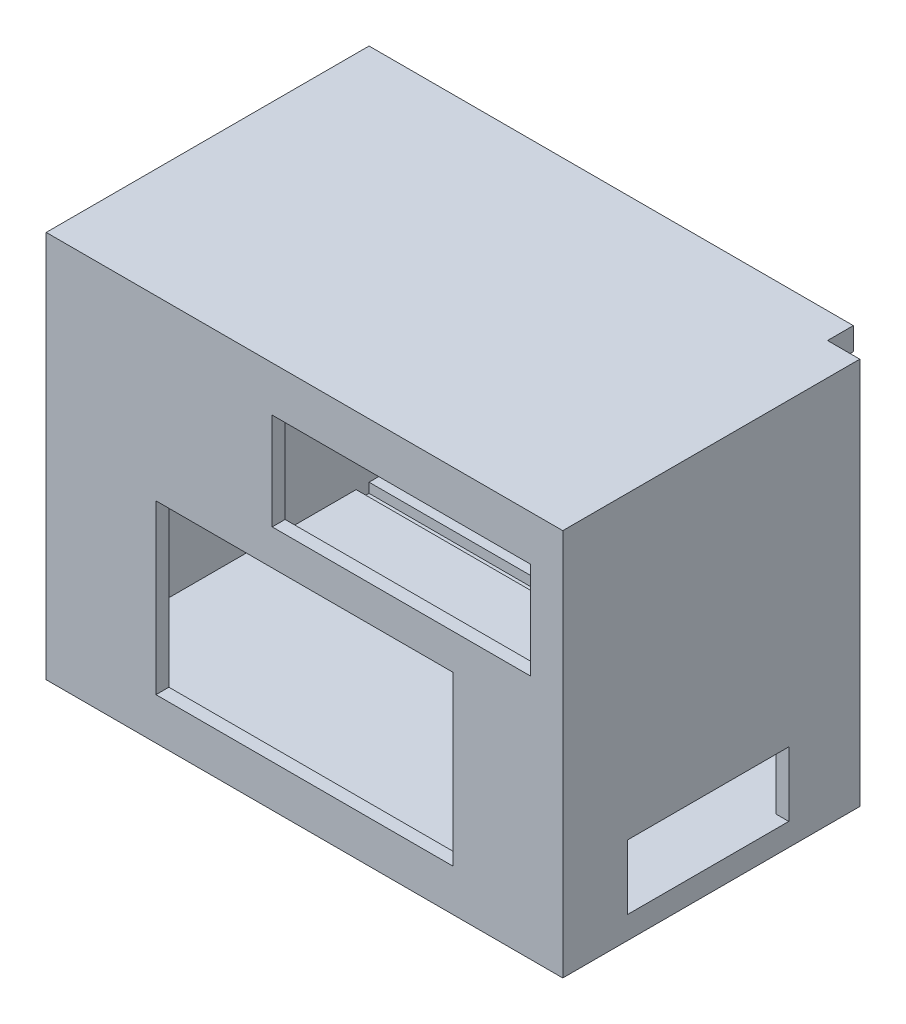
ISO-10303-21;
HEADER;
FILE_DESCRIPTION(('STEP AP214'),'2;1');
FILE_NAME('part.step','',(''),(''),'','','');
FILE_SCHEMA(('AUTOMOTIVE_DESIGN { 1 0 10303 214 1 1 1 1 }'));
ENDSEC;
DATA;
#1=APPLICATION_CONTEXT('core data for automotive mechanical design processes');
#2=APPLICATION_PROTOCOL_DEFINITION('international standard','automotive_design',2000,#1);
#3=PRODUCT_CONTEXT('',#1,'mechanical');
#4=PRODUCT('Part','Part','',(#3));
#5=PRODUCT_RELATED_PRODUCT_CATEGORY('part','',(#4));
#6=PRODUCT_DEFINITION_FORMATION('','',#4);
#7=PRODUCT_DEFINITION_CONTEXT('part definition',#1,'design');
#8=PRODUCT_DEFINITION('design','',#6,#7);
#9=PRODUCT_DEFINITION_SHAPE('','',#8);
#10=(LENGTH_UNIT() NAMED_UNIT(*) SI_UNIT(.MILLI.,.METRE.));
#11=(NAMED_UNIT(*) PLANE_ANGLE_UNIT() SI_UNIT($,.RADIAN.));
#12=(NAMED_UNIT(*) SI_UNIT($,.STERADIAN.) SOLID_ANGLE_UNIT());
#13=UNCERTAINTY_MEASURE_WITH_UNIT(LENGTH_MEASURE(1.E-05),#10,'distance_accuracy_value','');
#14=(GEOMETRIC_REPRESENTATION_CONTEXT(3) GLOBAL_UNCERTAINTY_ASSIGNED_CONTEXT((#13)) GLOBAL_UNIT_ASSIGNED_CONTEXT((#10,
#11,#12)) REPRESENTATION_CONTEXT('',''));
#15=CARTESIAN_POINT('',(0.,0.,0.));
#16=DIRECTION('',(0.,0.,1.));
#17=DIRECTION('',(1.,0.,0.));
#18=AXIS2_PLACEMENT_3D('',#15,#16,#17);
#19=CARTESIAN_POINT('',(2.,3.5,48.));
#20=DIRECTION('',(0.,1.,0.));
#21=DIRECTION('',(0.,0.,1.));
#22=AXIS2_PLACEMENT_3D('',#19,#20,#21);
#23=PLANE('',#22);
#24=DIRECTION('',(1.,0.,0.));
#25=VECTOR('',#24,1.);
#26=CARTESIAN_POINT('',(0.,3.5,3.99999999999999));
#27=LINE('',#26,#25);
#28=CARTESIAN_POINT('',(2.00000000003027,3.49999999997408,4.));
#29=VERTEX_POINT('',#28);
#30=CARTESIAN_POINT('',(78.,3.5,3.99999999999999));
#31=VERTEX_POINT('',#30);
#32=EDGE_CURVE('E423',#29,#31,#27,.T.);
#33=ORIENTED_EDGE('',*,*,#32,.F.);
#34=DIRECTION('',(0.,0.,-1.));
#35=VECTOR('',#34,1.);
#36=CARTESIAN_POINT('',(2.,3.5,48.));
#37=LINE('',#36,#35);
#38=CARTESIAN_POINT('',(2.,3.5,48.));
#39=VERTEX_POINT('',#38);
#40=EDGE_CURVE('E287',#39,#29,#37,.T.);
#41=ORIENTED_EDGE('',*,*,#40,.F.);
#42=DIRECTION('',(1.,0.,0.));
#43=VECTOR('',#42,1.);
#44=CARTESIAN_POINT('',(2.,3.5,48.));
#45=LINE('',#44,#43);
#46=CARTESIAN_POINT('',(78.,3.5,48.));
#47=VERTEX_POINT('',#46);
#48=EDGE_CURVE('E283',#39,#47,#45,.T.);
#49=ORIENTED_EDGE('',*,*,#48,.T.);
#50=DIRECTION('',(0.,0.,-1.));
#51=VECTOR('',#50,1.);
#52=CARTESIAN_POINT('',(78.,3.5,48.));
#53=LINE('',#52,#51);
#54=CARTESIAN_POINT('',(78.,3.5,40.));
#55=VERTEX_POINT('',#54);
#56=EDGE_CURVE('E277',#47,#55,#53,.T.);
#57=ORIENTED_EDGE('',*,*,#56,.T.);
#58=DIRECTION('',(1.,0.,0.));
#59=VECTOR('',#58,1.);
#60=CARTESIAN_POINT('',(78.,3.5,40.));
#61=LINE('',#60,#59);
#62=CARTESIAN_POINT('',(80.,3.5,40.));
#63=VERTEX_POINT('',#62);
#64=EDGE_CURVE('E262',#55,#63,#61,.T.);
#65=ORIENTED_EDGE('',*,*,#64,.T.);
#66=DIRECTION('',(0.,0.,-1.));
#67=VECTOR('',#66,1.);
#68=CARTESIAN_POINT('',(80.,3.5,40.));
#69=LINE('',#68,#67);
#70=CARTESIAN_POINT('',(80.,3.5,15.));
#71=VERTEX_POINT('',#70);
#72=EDGE_CURVE('E910',#63,#71,#69,.T.);
#73=ORIENTED_EDGE('',*,*,#72,.T.);
#74=DIRECTION('',(1.,0.,0.));
#75=VECTOR('',#74,1.);
#76=CARTESIAN_POINT('',(78.,3.5,15.));
#77=LINE('',#76,#75);
#78=CARTESIAN_POINT('',(78.,3.5,15.));
#79=VERTEX_POINT('',#78);
#80=EDGE_CURVE('E271',#79,#71,#77,.T.);
#81=ORIENTED_EDGE('',*,*,#80,.F.);
#82=EDGE_CURVE('E285',#79,#31,#53,.T.);
#83=ORIENTED_EDGE('',*,*,#82,.T.);
#84=EDGE_LOOP('',(#33,#41,#49,#57,#65,#73,#81,#83));
#85=FACE_BOUND('',#84,.T.);
#86=ADVANCED_FACE('F43',(#85),#23,.T.);
#87=CARTESIAN_POINT('',(2.,56.5,48.));
#88=DIRECTION('',(0.,1.,0.));
#89=DIRECTION('',(0.,0.,1.));
#90=AXIS2_PLACEMENT_3D('',#87,#88,#89);
#91=PLANE('',#90);
#92=DIRECTION('',(0.,0.,-1.));
#93=VECTOR('',#92,1.);
#94=CARTESIAN_POINT('',(2.,56.5,48.));
#95=LINE('',#94,#93);
#96=CARTESIAN_POINT('',(2.,56.5,48.));
#97=VERTEX_POINT('',#96);
#98=CARTESIAN_POINT('',(2.,56.5,45.));
#99=VERTEX_POINT('',#98);
#100=EDGE_CURVE('E294',#97,#99,#95,.T.);
#101=ORIENTED_EDGE('',*,*,#100,.T.);
#102=DIRECTION('',(-1.,0.,0.));
#103=VECTOR('',#102,1.);
#104=CARTESIAN_POINT('',(2.,56.5,45.));
#105=LINE('',#104,#103);
#106=CARTESIAN_POINT('',(0.,56.5,45.));
#107=VERTEX_POINT('',#106);
#108=EDGE_CURVE('E566',#99,#107,#105,.T.);
#109=ORIENTED_EDGE('',*,*,#108,.T.);
#110=DIRECTION('',(0.,0.,-1.));
#111=VECTOR('',#110,1.);
#112=CARTESIAN_POINT('',(0.,56.5,45.));
#113=LINE('',#112,#111);
#114=CARTESIAN_POINT('',(0.,56.5,25.));
#115=VERTEX_POINT('',#114);
#116=EDGE_CURVE('E569',#107,#115,#113,.T.);
#117=ORIENTED_EDGE('',*,*,#116,.T.);
#118=DIRECTION('',(-1.,0.,0.));
#119=VECTOR('',#118,1.);
#120=CARTESIAN_POINT('',(2.,56.5,25.));
#121=LINE('',#120,#119);
#122=CARTESIAN_POINT('',(2.,56.5,25.));
#123=VERTEX_POINT('',#122);
#124=EDGE_CURVE('E572',#123,#115,#121,.T.);
#125=ORIENTED_EDGE('',*,*,#124,.F.);
#126=CARTESIAN_POINT('',(2.00000000003026,56.5000000000282,4.));
#127=VERTEX_POINT('',#126);
#128=EDGE_CURVE('E297',#123,#127,#95,.T.);
#129=ORIENTED_EDGE('',*,*,#128,.T.);
#130=DIRECTION('',(1.,0.,0.));
#131=VECTOR('',#130,1.);
#132=CARTESIAN_POINT('',(0.,56.5,3.99999999999999));
#133=LINE('',#132,#131);
#134=CARTESIAN_POINT('',(78.,56.5,3.99999999999999));
#135=VERTEX_POINT('',#134);
#136=EDGE_CURVE('E533',#127,#135,#133,.T.);
#137=ORIENTED_EDGE('',*,*,#136,.T.);
#138=DIRECTION('',(0.,0.,-1.));
#139=VECTOR('',#138,1.);
#140=CARTESIAN_POINT('',(78.,56.5,48.));
#141=LINE('',#140,#139);
#142=CARTESIAN_POINT('',(78.,56.5,48.));
#143=VERTEX_POINT('',#142);
#144=EDGE_CURVE('E289',#143,#135,#141,.T.);
#145=ORIENTED_EDGE('',*,*,#144,.F.);
#146=DIRECTION('',(1.,0.,0.));
#147=VECTOR('',#146,1.);
#148=CARTESIAN_POINT('',(2.,56.5,48.));
#149=LINE('',#148,#147);
#150=EDGE_CURVE('E392',#97,#143,#149,.T.);
#151=ORIENTED_EDGE('',*,*,#150,.F.);
#152=EDGE_LOOP('',(#101,#109,#117,#125,#129,#137,#145,#151));
#153=FACE_BOUND('',#152,.T.);
#154=ADVANCED_FACE('F472',(#153),#91,.F.);
#155=CARTESIAN_POINT('',(75.,0.,3.99999999999999));
#156=DIRECTION('',(-1.,0.,0.));
#157=DIRECTION('',(0.,0.,1.));
#158=AXIS2_PLACEMENT_3D('',#155,#156,#157);
#159=PLANE('',#158);
#160=DIRECTION('',(0.,0.,-1.));
#161=VECTOR('',#160,1.);
#162=CARTESIAN_POINT('',(74.9999999999886,57.9999999999735,4.));
#163=LINE('',#162,#161);
#164=CARTESIAN_POINT('',(75.,57.9999999999735,3.99999999999999));
#165=VERTEX_POINT('',#164);
#166=CARTESIAN_POINT('',(74.9999999999886,57.9999999999735,2.));
#167=VERTEX_POINT('',#166);
#168=EDGE_CURVE('E531',#165,#167,#163,.T.);
#169=ORIENTED_EDGE('',*,*,#168,.T.);
#170=DIRECTION('',(0.,-1.,0.));
#171=VECTOR('',#170,1.);
#172=CARTESIAN_POINT('',(74.9999999999886,-291537.,2.));
#173=LINE('',#172,#171);
#174=CARTESIAN_POINT('',(74.9999999999886,56.5000000000282,2.));
#175=VERTEX_POINT('',#174);
#176=EDGE_CURVE('E521',#167,#175,#173,.T.);
#177=ORIENTED_EDGE('',*,*,#176,.T.);
#178=DIRECTION('',(0.,0.,-1.));
#179=VECTOR('',#178,1.);
#180=CARTESIAN_POINT('',(75.,56.5,3.99999999999999));
#181=LINE('',#180,#179);
#182=CARTESIAN_POINT('',(75.,56.5,0.));
#183=VERTEX_POINT('',#182);
#184=EDGE_CURVE('E422',#175,#183,#181,.T.);
#185=ORIENTED_EDGE('',*,*,#184,.T.);
#186=DIRECTION('',(0.,1.,0.));
#187=VECTOR('',#186,1.);
#188=CARTESIAN_POINT('',(75.,0.,0.));
#189=LINE('',#188,#187);
#190=CARTESIAN_POINT('',(75.,60.,0.));
#191=VERTEX_POINT('',#190);
#192=EDGE_CURVE('E429',#183,#191,#189,.T.);
#193=ORIENTED_EDGE('',*,*,#192,.T.);
#194=DIRECTION('',(0.,0.,-1.));
#195=VECTOR('',#194,1.);
#196=CARTESIAN_POINT('',(75.,60.,3.99999999999999));
#197=LINE('',#196,#195);
#198=CARTESIAN_POINT('',(75.,60.,3.99999999999999));
#199=VERTEX_POINT('',#198);
#200=EDGE_CURVE('E438',#199,#191,#197,.T.);
#201=ORIENTED_EDGE('',*,*,#200,.F.);
#202=DIRECTION('',(0.,1.,0.));
#203=VECTOR('',#202,1.);
#204=CARTESIAN_POINT('',(75.,0.,3.99999999999999));
#205=LINE('',#204,#203);
#206=EDGE_CURVE('E529',#165,#199,#205,.T.);
#207=ORIENTED_EDGE('',*,*,#206,.F.);
#208=EDGE_LOOP('',(#169,#177,#185,#193,#201,#207));
#209=FACE_BOUND('',#208,.T.);
#210=ADVANCED_FACE('F462',(#209),#159,.F.);
#211=CARTESIAN_POINT('',(0.,0.,50.));
#212=DIRECTION('',(0.,0.,1.));
#213=DIRECTION('',(1.,0.,0.));
#214=AXIS2_PLACEMENT_3D('',#211,#212,#213);
#215=PLANE('',#214);
#216=DIRECTION('',(0.,-1.,0.));
#217=VECTOR('',#216,1.);
#218=CARTESIAN_POINT('',(75.,53.,50.));
#219=LINE('',#218,#217);
#220=CARTESIAN_POINT('',(75.,53.,50.));
#221=VERTEX_POINT('',#220);
#222=CARTESIAN_POINT('',(75.,38.,50.));
#223=VERTEX_POINT('',#222);
#224=EDGE_CURVE('E361',#221,#223,#219,.T.);
#225=ORIENTED_EDGE('',*,*,#224,.T.);
#226=DIRECTION('',(-1.,0.,0.));
#227=VECTOR('',#226,1.);
#228=CARTESIAN_POINT('',(75.,38.,50.));
#229=LINE('',#228,#227);
#230=CARTESIAN_POINT('',(35.,38.,50.));
#231=VERTEX_POINT('',#230);
#232=EDGE_CURVE('E364',#223,#231,#229,.T.);
#233=ORIENTED_EDGE('',*,*,#232,.T.);
#234=DIRECTION('',(0.,-1.,0.));
#235=VECTOR('',#234,1.);
#236=CARTESIAN_POINT('',(35.,53.,50.));
#237=LINE('',#236,#235);
#238=CARTESIAN_POINT('',(35.,53.,50.));
#239=VERTEX_POINT('',#238);
#240=EDGE_CURVE('E372',#239,#231,#237,.T.);
#241=ORIENTED_EDGE('',*,*,#240,.F.);
#242=DIRECTION('',(-1.,0.,0.));
#243=VECTOR('',#242,1.);
#244=CARTESIAN_POINT('',(75.,53.,50.));
#245=LINE('',#244,#243);
#246=EDGE_CURVE('E375',#221,#239,#245,.T.);
#247=ORIENTED_EDGE('',*,*,#246,.F.);
#248=EDGE_LOOP('',(#225,#233,#241,#247));
#249=FACE_BOUND('',#248,.T.);
#250=DIRECTION('',(1.,0.,0.));
#251=VECTOR('',#250,1.);
#252=CARTESIAN_POINT('',(0.,60.,50.));
#253=LINE('',#252,#251);
#254=CARTESIAN_POINT('',(0.,60.,50.));
#255=VERTEX_POINT('',#254);
#256=CARTESIAN_POINT('',(80.,60.,50.));
#257=VERTEX_POINT('',#256);
#258=EDGE_CURVE('E299',#255,#257,#253,.T.);
#259=ORIENTED_EDGE('',*,*,#258,.F.);
#260=DIRECTION('',(0.,1.,0.));
#261=VECTOR('',#260,1.);
#262=CARTESIAN_POINT('',(0.,0.,50.));
#263=LINE('',#262,#261);
#264=CARTESIAN_POINT('',(0.,0.,50.));
#265=VERTEX_POINT('',#264);
#266=EDGE_CURVE('E307',#265,#255,#263,.T.);
#267=ORIENTED_EDGE('',*,*,#266,.F.);
#268=DIRECTION('',(1.,0.,0.));
#269=VECTOR('',#268,1.);
#270=CARTESIAN_POINT('',(0.,0.,50.));
#271=LINE('',#270,#269);
#272=CARTESIAN_POINT('',(80.,0.,50.));
#273=VERTEX_POINT('',#272);
#274=EDGE_CURVE('E305',#265,#273,#271,.T.);
#275=ORIENTED_EDGE('',*,*,#274,.T.);
#276=DIRECTION('',(0.,1.,0.));
#277=VECTOR('',#276,1.);
#278=CARTESIAN_POINT('',(80.,0.,50.));
#279=LINE('',#278,#277);
#280=EDGE_CURVE('E302',#273,#257,#279,.T.);
#281=ORIENTED_EDGE('',*,*,#280,.T.);
#282=EDGE_LOOP('',(#259,#267,#275,#281));
#283=FACE_BOUND('',#282,.T.);
#284=DIRECTION('',(1.,0.,0.));
#285=VECTOR('',#284,1.);
#286=CARTESIAN_POINT('',(17.,6.5,50.));
#287=LINE('',#286,#285);
#288=CARTESIAN_POINT('',(17.,6.5,50.));
#289=VERTEX_POINT('',#288);
#290=CARTESIAN_POINT('',(63.,6.5,50.));
#291=VERTEX_POINT('',#290);
#292=EDGE_CURVE('E443',#289,#291,#287,.T.);
#293=ORIENTED_EDGE('',*,*,#292,.F.);
#294=DIRECTION('',(0.,-1.,0.));
#295=VECTOR('',#294,1.);
#296=CARTESIAN_POINT('',(17.,32.5,50.));
#297=LINE('',#296,#295);
#298=CARTESIAN_POINT('',(17.,32.5,50.));
#299=VERTEX_POINT('',#298);
#300=EDGE_CURVE('E360',#299,#289,#297,.T.);
#301=ORIENTED_EDGE('',*,*,#300,.F.);
#302=DIRECTION('',(1.,0.,0.));
#303=VECTOR('',#302,1.);
#304=CARTESIAN_POINT('',(17.,32.5,50.));
#305=LINE('',#304,#303);
#306=CARTESIAN_POINT('',(63.,32.5,50.));
#307=VERTEX_POINT('',#306);
#308=EDGE_CURVE('E448',#299,#307,#305,.T.);
#309=ORIENTED_EDGE('',*,*,#308,.T.);
#310=DIRECTION('',(0.,-1.,0.));
#311=VECTOR('',#310,1.);
#312=CARTESIAN_POINT('',(63.,32.5,50.));
#313=LINE('',#312,#311);
#314=EDGE_CURVE('E445',#307,#291,#313,.T.);
#315=ORIENTED_EDGE('',*,*,#314,.T.);
#316=EDGE_LOOP('',(#293,#301,#309,#315));
#317=FACE_BOUND('',#316,.T.);
#318=ADVANCED_FACE('F460',(#249,#283,#317),#215,.T.);
#319=CARTESIAN_POINT('',(0.,0.,48.));
#320=DIRECTION('',(0.,0.,-1.));
#321=DIRECTION('',(-1.,0.,0.));
#322=AXIS2_PLACEMENT_3D('',#319,#320,#321);
#323=PLANE('',#322);
#324=DIRECTION('',(0.,-1.,0.));
#325=VECTOR('',#324,1.);
#326=CARTESIAN_POINT('',(75.,0.,48.));
#327=LINE('',#326,#325);
#328=CARTESIAN_POINT('',(75.,53.,48.));
#329=VERTEX_POINT('',#328);
#330=CARTESIAN_POINT('',(75.,38.,48.));
#331=VERTEX_POINT('',#330);
#332=EDGE_CURVE('E336',#329,#331,#327,.T.);
#333=ORIENTED_EDGE('',*,*,#332,.F.);
#334=DIRECTION('',(-1.,0.,0.));
#335=VECTOR('',#334,1.);
#336=CARTESIAN_POINT('',(0.,53.,48.));
#337=LINE('',#336,#335);
#338=CARTESIAN_POINT('',(35.,53.,48.));
#339=VERTEX_POINT('',#338);
#340=EDGE_CURVE('E333',#329,#339,#337,.T.);
#341=ORIENTED_EDGE('',*,*,#340,.T.);
#342=DIRECTION('',(0.,-1.,0.));
#343=VECTOR('',#342,1.);
#344=CARTESIAN_POINT('',(35.,0.,48.));
#345=LINE('',#344,#343);
#346=CARTESIAN_POINT('',(35.,38.,48.));
#347=VERTEX_POINT('',#346);
#348=EDGE_CURVE('E330',#339,#347,#345,.T.);
#349=ORIENTED_EDGE('',*,*,#348,.T.);
#350=DIRECTION('',(-1.,0.,0.));
#351=VECTOR('',#350,1.);
#352=CARTESIAN_POINT('',(0.,38.,48.));
#353=LINE('',#352,#351);
#354=EDGE_CURVE('E321',#331,#347,#353,.T.);
#355=ORIENTED_EDGE('',*,*,#354,.F.);
#356=EDGE_LOOP('',(#333,#341,#349,#355));
#357=FACE_BOUND('',#356,.T.);
#358=DIRECTION('',(0.,1.,0.));
#359=VECTOR('',#358,1.);
#360=CARTESIAN_POINT('',(2.,3.5,48.));
#361=LINE('',#360,#359);
#362=EDGE_CURVE('E389',#39,#97,#361,.T.);
#363=ORIENTED_EDGE('',*,*,#362,.T.);
#364=ORIENTED_EDGE('',*,*,#150,.T.);
#365=DIRECTION('',(0.,1.,0.));
#366=VECTOR('',#365,1.);
#367=CARTESIAN_POINT('',(78.,3.5,48.));
#368=LINE('',#367,#366);
#369=EDGE_CURVE('E396',#47,#143,#368,.T.);
#370=ORIENTED_EDGE('',*,*,#369,.F.);
#371=ORIENTED_EDGE('',*,*,#48,.F.);
#372=EDGE_LOOP('',(#363,#364,#370,#371));
#373=FACE_BOUND('',#372,.T.);
#374=DIRECTION('',(1.,0.,0.));
#375=VECTOR('',#374,1.);
#376=CARTESIAN_POINT('',(0.,32.5,48.));
#377=LINE('',#376,#375);
#378=CARTESIAN_POINT('',(17.,32.5,48.));
#379=VERTEX_POINT('',#378);
#380=CARTESIAN_POINT('',(63.,32.5,48.));
#381=VERTEX_POINT('',#380);
#382=EDGE_CURVE('E339',#379,#381,#377,.T.);
#383=ORIENTED_EDGE('',*,*,#382,.F.);
#384=DIRECTION('',(0.,-1.,0.));
#385=VECTOR('',#384,1.);
#386=CARTESIAN_POINT('',(17.,0.,48.));
#387=LINE('',#386,#385);
#388=CARTESIAN_POINT('',(17.,6.5,48.));
#389=VERTEX_POINT('',#388);
#390=EDGE_CURVE('E11',#379,#389,#387,.T.);
#391=ORIENTED_EDGE('',*,*,#390,.T.);
#392=DIRECTION('',(1.,0.,0.));
#393=VECTOR('',#392,1.);
#394=CARTESIAN_POINT('',(0.,6.5,48.));
#395=LINE('',#394,#393);
#396=CARTESIAN_POINT('',(63.,6.5,48.));
#397=VERTEX_POINT('',#396);
#398=EDGE_CURVE('E51',#389,#397,#395,.T.);
#399=ORIENTED_EDGE('',*,*,#398,.T.);
#400=DIRECTION('',(0.,-1.,0.));
#401=VECTOR('',#400,1.);
#402=CARTESIAN_POINT('',(63.,0.,48.));
#403=LINE('',#402,#401);
#404=EDGE_CURVE('E341',#381,#397,#403,.T.);
#405=ORIENTED_EDGE('',*,*,#404,.F.);
#406=EDGE_LOOP('',(#383,#391,#399,#405));
#407=FACE_BOUND('',#406,.T.);
#408=ADVANCED_FACE('F346',(#357,#373,#407),#323,.T.);
#409=CARTESIAN_POINT('',(0.,60.,50.));
#410=DIRECTION('',(0.,1.,0.));
#411=DIRECTION('',(0.,0.,1.));
#412=AXIS2_PLACEMENT_3D('',#409,#410,#411);
#413=PLANE('',#412);
#414=ORIENTED_EDGE('',*,*,#200,.T.);
#415=DIRECTION('',(1.,0.,0.));
#416=VECTOR('',#415,1.);
#417=CARTESIAN_POINT('',(0.,60.,0.));
#418=LINE('',#417,#416);
#419=CARTESIAN_POINT('',(0.,60.,0.));
#420=VERTEX_POINT('',#419);
#421=EDGE_CURVE('E311',#420,#191,#418,.T.);
#422=ORIENTED_EDGE('',*,*,#421,.F.);
#423=DIRECTION('',(0.,0.,-1.));
#424=VECTOR('',#423,1.);
#425=CARTESIAN_POINT('',(0.,60.,50.));
#426=LINE('',#425,#424);
#427=EDGE_CURVE('E319',#255,#420,#426,.T.);
#428=ORIENTED_EDGE('',*,*,#427,.F.);
#429=ORIENTED_EDGE('',*,*,#258,.T.);
#430=DIRECTION('',(0.,0.,-1.));
#431=VECTOR('',#430,1.);
#432=CARTESIAN_POINT('',(80.,60.,50.));
#433=LINE('',#432,#431);
#434=CARTESIAN_POINT('',(80.,60.,3.99999999999999));
#435=VERTEX_POINT('',#434);
#436=EDGE_CURVE('E310',#257,#435,#433,.T.);
#437=ORIENTED_EDGE('',*,*,#436,.T.);
#438=DIRECTION('',(1.,0.,0.));
#439=VECTOR('',#438,1.);
#440=CARTESIAN_POINT('',(0.,60.,3.99999999999999));
#441=LINE('',#440,#439);
#442=EDGE_CURVE('E527',#199,#435,#441,.T.);
#443=ORIENTED_EDGE('',*,*,#442,.F.);
#444=EDGE_LOOP('',(#414,#422,#428,#429,#437,#443));
#445=FACE_BOUND('',#444,.T.);
#446=ADVANCED_FACE('F45',(#445),#413,.T.);
#447=CARTESIAN_POINT('',(0.,0.,50.));
#448=DIRECTION('',(-1.,0.,0.));
#449=DIRECTION('',(0.,0.,1.));
#450=AXIS2_PLACEMENT_3D('',#447,#448,#449);
#451=PLANE('',#450);
#452=DIRECTION('',(0.,1.,0.));
#453=VECTOR('',#452,1.);
#454=CARTESIAN_POINT('',(0.,56.5,45.));
#455=LINE('',#454,#453);
#456=CARTESIAN_POINT('',(0.,36.5,45.));
#457=VERTEX_POINT('',#456);
#458=EDGE_CURVE('E580',#457,#107,#455,.T.);
#459=ORIENTED_EDGE('',*,*,#458,.F.);
#460=DIRECTION('',(0.,0.,1.));
#461=VECTOR('',#460,1.);
#462=CARTESIAN_POINT('',(0.,36.5,45.));
#463=LINE('',#462,#461);
#464=CARTESIAN_POINT('',(0.,36.5,25.));
#465=VERTEX_POINT('',#464);
#466=EDGE_CURVE('E584',#465,#457,#463,.T.);
#467=ORIENTED_EDGE('',*,*,#466,.F.);
#468=DIRECTION('',(0.,-1.,0.));
#469=VECTOR('',#468,1.);
#470=CARTESIAN_POINT('',(0.,56.5,25.));
#471=LINE('',#470,#469);
#472=EDGE_CURVE('E582',#115,#465,#471,.T.);
#473=ORIENTED_EDGE('',*,*,#472,.F.);
#474=ORIENTED_EDGE('',*,*,#116,.F.);
#475=EDGE_LOOP('',(#459,#467,#473,#474));
#476=FACE_BOUND('',#475,.T.);
#477=DIRECTION('',(0.,1.,0.));
#478=VECTOR('',#477,1.);
#479=CARTESIAN_POINT('',(0.,0.,0.));
#480=LINE('',#479,#478);
#481=CARTESIAN_POINT('',(0.,0.,0.));
#482=VERTEX_POINT('',#481);
#483=EDGE_CURVE('E303',#482,#420,#480,.T.);
#484=ORIENTED_EDGE('',*,*,#483,.F.);
#485=DIRECTION('',(0.,0.,-1.));
#486=VECTOR('',#485,1.);
#487=CARTESIAN_POINT('',(0.,0.,50.));
#488=LINE('',#487,#486);
#489=EDGE_CURVE('E322',#265,#482,#488,.T.);
#490=ORIENTED_EDGE('',*,*,#489,.F.);
#491=ORIENTED_EDGE('',*,*,#266,.T.);
#492=ORIENTED_EDGE('',*,*,#427,.T.);
#493=EDGE_LOOP('',(#484,#490,#491,#492));
#494=FACE_BOUND('',#493,.T.);
#495=ADVANCED_FACE('F577',(#476,#494),#451,.T.);
#496=CARTESIAN_POINT('',(0.,0.,50.));
#497=DIRECTION('',(0.,1.,0.));
#498=DIRECTION('',(-1.,0.,0.));
#499=AXIS2_PLACEMENT_3D('',#496,#497,#498);
#500=PLANE('',#499);
#501=DIRECTION('',(1.,0.,0.));
#502=VECTOR('',#501,1.);
#503=CARTESIAN_POINT('',(0.,0.,0.));
#504=LINE('',#503,#502);
#505=CARTESIAN_POINT('',(75.,0.,0.));
#506=VERTEX_POINT('',#505);
#507=EDGE_CURVE('E314',#482,#506,#504,.T.);
#508=ORIENTED_EDGE('',*,*,#507,.T.);
#509=DIRECTION('',(0.,0.,-1.));
#510=VECTOR('',#509,1.);
#511=CARTESIAN_POINT('',(75.,0.,3.99999999999999));
#512=LINE('',#511,#510);
#513=CARTESIAN_POINT('',(75.,0.,3.99999999999999));
#514=VERTEX_POINT('',#513);
#515=EDGE_CURVE('E428',#514,#506,#512,.T.);
#516=ORIENTED_EDGE('',*,*,#515,.F.);
#517=DIRECTION('',(1.,0.,0.));
#518=VECTOR('',#517,1.);
#519=CARTESIAN_POINT('',(0.,0.,3.99999999999999));
#520=LINE('',#519,#518);
#521=CARTESIAN_POINT('',(80.,0.,3.99999999999999));
#522=VERTEX_POINT('',#521);
#523=EDGE_CURVE('E542',#514,#522,#520,.T.);
#524=ORIENTED_EDGE('',*,*,#523,.T.);
#525=DIRECTION('',(0.,0.,-1.));
#526=VECTOR('',#525,1.);
#527=CARTESIAN_POINT('',(80.,0.,50.));
#528=LINE('',#527,#526);
#529=EDGE_CURVE('E324',#273,#522,#528,.T.);
#530=ORIENTED_EDGE('',*,*,#529,.F.);
#531=ORIENTED_EDGE('',*,*,#274,.F.);
#532=ORIENTED_EDGE('',*,*,#489,.T.);
#533=EDGE_LOOP('',(#508,#516,#524,#530,#531,#532));
#534=FACE_BOUND('',#533,.T.);
#535=ADVANCED_FACE('F631',(#534),#500,.F.);
#536=CARTESIAN_POINT('',(80.,0.,50.));
#537=DIRECTION('',(-1.,0.,0.));
#538=DIRECTION('',(0.,0.,1.));
#539=AXIS2_PLACEMENT_3D('',#536,#537,#538);
#540=PLANE('',#539);
#541=ORIENTED_EDGE('',*,*,#72,.F.);
#542=DIRECTION('',(0.,-1.,0.));
#543=VECTOR('',#542,1.);
#544=CARTESIAN_POINT('',(80.,3.5,40.));
#545=LINE('',#544,#543);
#546=CARTESIAN_POINT('',(80.,13.5,40.));
#547=VERTEX_POINT('',#546);
#548=EDGE_CURVE('E58',#547,#63,#545,.T.);
#549=ORIENTED_EDGE('',*,*,#548,.F.);
#550=DIRECTION('',(0.,0.,1.));
#551=VECTOR('',#550,1.);
#552=CARTESIAN_POINT('',(80.,13.5,40.));
#553=LINE('',#552,#551);
#554=CARTESIAN_POINT('',(80.,13.5,15.));
#555=VERTEX_POINT('',#554);
#556=EDGE_CURVE('E280',#555,#547,#553,.T.);
#557=ORIENTED_EDGE('',*,*,#556,.F.);
#558=DIRECTION('',(0.,1.,0.));
#559=VECTOR('',#558,1.);
#560=CARTESIAN_POINT('',(80.,3.5,15.));
#561=LINE('',#560,#559);
#562=EDGE_CURVE('E907',#71,#555,#561,.T.);
#563=ORIENTED_EDGE('',*,*,#562,.F.);
#564=EDGE_LOOP('',(#541,#549,#557,#563));
#565=FACE_BOUND('',#564,.T.);
#566=ORIENTED_EDGE('',*,*,#529,.T.);
#567=DIRECTION('',(0.,1.,0.));
#568=VECTOR('',#567,1.);
#569=CARTESIAN_POINT('',(80.,0.,3.99999999999999));
#570=LINE('',#569,#568);
#571=EDGE_CURVE('E538',#522,#435,#570,.T.);
#572=ORIENTED_EDGE('',*,*,#571,.T.);
#573=ORIENTED_EDGE('',*,*,#436,.F.);
#574=ORIENTED_EDGE('',*,*,#280,.F.);
#575=EDGE_LOOP('',(#566,#572,#573,#574));
#576=FACE_BOUND('',#575,.T.);
#577=ADVANCED_FACE('F502',(#565,#576),#540,.F.);
#578=CARTESIAN_POINT('',(0.,0.,0.));
#579=DIRECTION('',(0.,0.,1.));
#580=DIRECTION('',(1.,0.,0.));
#581=AXIS2_PLACEMENT_3D('',#578,#579,#580);
#582=PLANE('',#581);
#583=DIRECTION('',(1.,0.,0.));
#584=VECTOR('',#583,1.);
#585=CARTESIAN_POINT('',(2.,3.5,0.));
#586=LINE('',#585,#584);
#587=CARTESIAN_POINT('',(2.,3.5,0.));
#588=VERTEX_POINT('',#587);
#589=CARTESIAN_POINT('',(75.,3.5,0.));
#590=VERTEX_POINT('',#589);
#591=EDGE_CURVE('E393',#588,#590,#586,.T.);
#592=ORIENTED_EDGE('',*,*,#591,.T.);
#593=EDGE_CURVE('E411',#506,#590,#189,.T.);
#594=ORIENTED_EDGE('',*,*,#593,.F.);
#595=ORIENTED_EDGE('',*,*,#507,.F.);
#596=ORIENTED_EDGE('',*,*,#483,.T.);
#597=ORIENTED_EDGE('',*,*,#421,.T.);
#598=ORIENTED_EDGE('',*,*,#192,.F.);
#599=DIRECTION('',(1.,0.,0.));
#600=VECTOR('',#599,1.);
#601=CARTESIAN_POINT('',(2.,56.5,0.));
#602=LINE('',#601,#600);
#603=CARTESIAN_POINT('',(2.,56.5,0.));
#604=VERTEX_POINT('',#603);
#605=EDGE_CURVE('E401',#604,#183,#602,.T.);
#606=ORIENTED_EDGE('',*,*,#605,.F.);
#607=DIRECTION('',(0.,1.,0.));
#608=VECTOR('',#607,1.);
#609=CARTESIAN_POINT('',(2.,3.5,0.));
#610=LINE('',#609,#608);
#611=EDGE_CURVE('E381',#588,#604,#610,.T.);
#612=ORIENTED_EDGE('',*,*,#611,.F.);
#613=EDGE_LOOP('',(#592,#594,#595,#596,#597,#598,#606,#612));
#614=FACE_BOUND('',#613,.T.);
#615=ADVANCED_FACE('F408',(#614),#582,.F.);
#616=CARTESIAN_POINT('',(2.,3.5,48.));
#617=DIRECTION('',(-1.,0.,0.));
#618=DIRECTION('',(0.,0.,1.));
#619=AXIS2_PLACEMENT_3D('',#616,#617,#618);
#620=PLANE('',#619);
#621=DIRECTION('',(0.,0.,1.));
#622=VECTOR('',#621,1.);
#623=CARTESIAN_POINT('',(2.,36.5,45.));
#624=LINE('',#623,#622);
#625=CARTESIAN_POINT('',(2.,36.5,25.));
#626=VERTEX_POINT('',#625);
#627=CARTESIAN_POINT('',(2.,36.5,45.));
#628=VERTEX_POINT('',#627);
#629=EDGE_CURVE('E573',#626,#628,#624,.T.);
#630=ORIENTED_EDGE('',*,*,#629,.T.);
#631=DIRECTION('',(0.,1.,0.));
#632=VECTOR('',#631,1.);
#633=CARTESIAN_POINT('',(2.,56.5,45.));
#634=LINE('',#633,#632);
#635=EDGE_CURVE('E563',#628,#99,#634,.T.);
#636=ORIENTED_EDGE('',*,*,#635,.T.);
#637=ORIENTED_EDGE('',*,*,#100,.F.);
#638=ORIENTED_EDGE('',*,*,#362,.F.);
#639=ORIENTED_EDGE('',*,*,#40,.T.);
#640=DIRECTION('',(0.,-1.,0.));
#641=VECTOR('',#640,1.);
#642=CARTESIAN_POINT('',(2.00000000006639,-291537.,4.));
#643=LINE('',#642,#641);
#644=CARTESIAN_POINT('',(2.00000000000955,2.00000000003293,4.));
#645=VERTEX_POINT('',#644);
#646=EDGE_CURVE('E554',#29,#645,#643,.T.);
#647=ORIENTED_EDGE('',*,*,#646,.T.);
#648=DIRECTION('',(0.,0.,-1.));
#649=VECTOR('',#648,1.);
#650=CARTESIAN_POINT('',(2.00000000000955,2.00000000003293,4.));
#651=LINE('',#650,#649);
#652=CARTESIAN_POINT('',(2.00000000000955,2.00000000003293,2.));
#653=VERTEX_POINT('',#652);
#654=EDGE_CURVE('E620',#645,#653,#651,.T.);
#655=ORIENTED_EDGE('',*,*,#654,.T.);
#656=DIRECTION('',(0.,-1.,0.));
#657=VECTOR('',#656,1.);
#658=CARTESIAN_POINT('',(2.00000000006639,-291537.,2.));
#659=LINE('',#658,#657);
#660=CARTESIAN_POINT('',(2.00000000003027,3.49999999997408,2.));
#661=VERTEX_POINT('',#660);
#662=EDGE_CURVE('E594',#661,#653,#659,.T.);
#663=ORIENTED_EDGE('',*,*,#662,.F.);
#664=EDGE_CURVE('E284',#661,#588,#37,.T.);
#665=ORIENTED_EDGE('',*,*,#664,.T.);
#666=ORIENTED_EDGE('',*,*,#611,.T.);
#667=CARTESIAN_POINT('',(2.00000000003026,56.5000000000282,2.));
#668=VERTEX_POINT('',#667);
#669=EDGE_CURVE('E298',#668,#604,#95,.T.);
#670=ORIENTED_EDGE('',*,*,#669,.F.);
#671=CARTESIAN_POINT('',(2.00000000000955,57.9999999999735,2.));
#672=VERTEX_POINT('',#671);
#673=EDGE_CURVE('E606',#672,#668,#659,.T.);
#674=ORIENTED_EDGE('',*,*,#673,.F.);
#675=DIRECTION('',(0.,0.,-1.));
#676=VECTOR('',#675,1.);
#677=CARTESIAN_POINT('',(2.00000000000955,57.9999999999735,4.));
#678=LINE('',#677,#676);
#679=CARTESIAN_POINT('',(2.00000000000955,57.9999999999735,4.));
#680=VERTEX_POINT('',#679);
#681=EDGE_CURVE('E605',#680,#672,#678,.T.);
#682=ORIENTED_EDGE('',*,*,#681,.F.);
#683=EDGE_CURVE('E598',#680,#127,#643,.T.);
#684=ORIENTED_EDGE('',*,*,#683,.T.);
#685=ORIENTED_EDGE('',*,*,#128,.F.);
#686=DIRECTION('',(0.,-1.,0.));
#687=VECTOR('',#686,1.);
#688=CARTESIAN_POINT('',(2.,56.5,25.));
#689=LINE('',#688,#687);
#690=EDGE_CURVE('E920',#123,#626,#689,.T.);
#691=ORIENTED_EDGE('',*,*,#690,.T.);
#692=EDGE_LOOP('',(#630,#636,#637,#638,#639,#647,#655,#663,#665,#666,#670,#674,#682,#684,#685,#691));
#693=FACE_BOUND('',#692,.T.);
#694=ADVANCED_FACE('F490',(#693),#620,.F.);
#695=DIRECTION('',(-1.,0.,0.));
#696=VECTOR('',#695,1.);
#697=CARTESIAN_POINT('',(2.,3.5,2.));
#698=LINE('',#697,#696);
#699=CARTESIAN_POINT('',(74.9999999999886,3.49999999997408,2.));
#700=VERTEX_POINT('',#699);
#701=EDGE_CURVE('E419',#700,#661,#698,.T.);
#702=ORIENTED_EDGE('',*,*,#701,.F.);
#703=DIRECTION('',(0.,0.,-1.));
#704=VECTOR('',#703,1.);
#705=CARTESIAN_POINT('',(75.,3.5,3.99999999999999));
#706=LINE('',#705,#704);
#707=EDGE_CURVE('E418',#700,#590,#706,.T.);
#708=ORIENTED_EDGE('',*,*,#707,.T.);
#709=ORIENTED_EDGE('',*,*,#591,.F.);
#710=ORIENTED_EDGE('',*,*,#664,.F.);
#711=EDGE_LOOP('',(#702,#708,#709,#710));
#712=FACE_BOUND('',#711,.T.);
#713=ADVANCED_FACE('F416',(#712),#23,.T.);
#714=CARTESIAN_POINT('',(78.,3.5,48.));
#715=DIRECTION('',(-1.,0.,0.));
#716=DIRECTION('',(0.,0.,1.));
#717=AXIS2_PLACEMENT_3D('',#714,#715,#716);
#718=PLANE('',#717);
#719=DIRECTION('',(0.,-1.,0.));
#720=VECTOR('',#719,1.);
#721=CARTESIAN_POINT('',(78.,3.5,40.));
#722=LINE('',#721,#720);
#723=CARTESIAN_POINT('',(78.,13.5,40.));
#724=VERTEX_POINT('',#723);
#725=EDGE_CURVE('E265',#724,#55,#722,.T.);
#726=ORIENTED_EDGE('',*,*,#725,.T.);
#727=ORIENTED_EDGE('',*,*,#56,.F.);
#728=ORIENTED_EDGE('',*,*,#369,.T.);
#729=ORIENTED_EDGE('',*,*,#144,.T.);
#730=DIRECTION('',(0.,1.,0.));
#731=VECTOR('',#730,1.);
#732=CARTESIAN_POINT('',(78.,0.,3.99999999999999));
#733=LINE('',#732,#731);
#734=EDGE_CURVE('E536',#31,#135,#733,.T.);
#735=ORIENTED_EDGE('',*,*,#734,.F.);
#736=ORIENTED_EDGE('',*,*,#82,.F.);
#737=DIRECTION('',(0.,1.,0.));
#738=VECTOR('',#737,1.);
#739=CARTESIAN_POINT('',(78.,3.5,15.));
#740=LINE('',#739,#738);
#741=CARTESIAN_POINT('',(78.,13.5,15.));
#742=VERTEX_POINT('',#741);
#743=EDGE_CURVE('E66',#79,#742,#740,.T.);
#744=ORIENTED_EDGE('',*,*,#743,.T.);
#745=DIRECTION('',(0.,0.,1.));
#746=VECTOR('',#745,1.);
#747=CARTESIAN_POINT('',(78.,13.5,40.));
#748=LINE('',#747,#746);
#749=EDGE_CURVE('E272',#742,#724,#748,.T.);
#750=ORIENTED_EDGE('',*,*,#749,.T.);
#751=EDGE_LOOP('',(#726,#727,#728,#729,#735,#736,#744,#750));
#752=FACE_BOUND('',#751,.T.);
#753=ADVANCED_FACE('F276',(#752),#718,.T.);
#754=ORIENTED_EDGE('',*,*,#184,.F.);
#755=DIRECTION('',(-1.,0.,0.));
#756=VECTOR('',#755,1.);
#757=CARTESIAN_POINT('',(2.,56.5,2.));
#758=LINE('',#757,#756);
#759=EDGE_CURVE('E432',#175,#668,#758,.T.);
#760=ORIENTED_EDGE('',*,*,#759,.T.);
#761=ORIENTED_EDGE('',*,*,#669,.T.);
#762=ORIENTED_EDGE('',*,*,#605,.T.);
#763=EDGE_LOOP('',(#754,#760,#761,#762));
#764=FACE_BOUND('',#763,.T.);
#765=ADVANCED_FACE('F487',(#764),#91,.F.);
#766=CARTESIAN_POINT('',(75.,53.,50.));
#767=DIRECTION('',(1.,0.,0.));
#768=DIRECTION('',(0.,0.,-1.));
#769=AXIS2_PLACEMENT_3D('',#766,#767,#768);
#770=PLANE('',#769);
#771=ORIENTED_EDGE('',*,*,#332,.T.);
#772=DIRECTION('',(0.,0.,-1.));
#773=VECTOR('',#772,1.);
#774=CARTESIAN_POINT('',(75.,38.,50.));
#775=LINE('',#774,#773);
#776=EDGE_CURVE('E377',#223,#331,#775,.T.);
#777=ORIENTED_EDGE('',*,*,#776,.F.);
#778=ORIENTED_EDGE('',*,*,#224,.F.);
#779=DIRECTION('',(0.,0.,-1.));
#780=VECTOR('',#779,1.);
#781=CARTESIAN_POINT('',(75.,53.,50.));
#782=LINE('',#781,#780);
#783=EDGE_CURVE('E378',#221,#329,#782,.T.);
#784=ORIENTED_EDGE('',*,*,#783,.T.);
#785=EDGE_LOOP('',(#771,#777,#778,#784));
#786=FACE_BOUND('',#785,.T.);
#787=ADVANCED_FACE('F504',(#786),#770,.F.);
#788=CARTESIAN_POINT('',(75.,53.,50.));
#789=DIRECTION('',(0.,-1.,0.));
#790=DIRECTION('',(0.,0.,-1.));
#791=AXIS2_PLACEMENT_3D('',#788,#789,#790);
#792=PLANE('',#791);
#793=ORIENTED_EDGE('',*,*,#783,.F.);
#794=ORIENTED_EDGE('',*,*,#246,.T.);
#795=DIRECTION('',(0.,0.,-1.));
#796=VECTOR('',#795,1.);
#797=CARTESIAN_POINT('',(35.,53.,50.));
#798=LINE('',#797,#796);
#799=EDGE_CURVE('E382',#239,#339,#798,.T.);
#800=ORIENTED_EDGE('',*,*,#799,.T.);
#801=ORIENTED_EDGE('',*,*,#340,.F.);
#802=EDGE_LOOP('',(#793,#794,#800,#801));
#803=FACE_BOUND('',#802,.T.);
#804=ADVANCED_FACE('F510',(#803),#792,.T.);
#805=CARTESIAN_POINT('',(35.,53.,50.));
#806=DIRECTION('',(1.,0.,0.));
#807=DIRECTION('',(0.,0.,-1.));
#808=AXIS2_PLACEMENT_3D('',#805,#806,#807);
#809=PLANE('',#808);
#810=ORIENTED_EDGE('',*,*,#799,.F.);
#811=ORIENTED_EDGE('',*,*,#240,.T.);
#812=DIRECTION('',(0.,0.,-1.));
#813=VECTOR('',#812,1.);
#814=CARTESIAN_POINT('',(35.,38.,50.));
#815=LINE('',#814,#813);
#816=EDGE_CURVE('E385',#231,#347,#815,.T.);
#817=ORIENTED_EDGE('',*,*,#816,.T.);
#818=ORIENTED_EDGE('',*,*,#348,.F.);
#819=EDGE_LOOP('',(#810,#811,#817,#818));
#820=FACE_BOUND('',#819,.T.);
#821=ADVANCED_FACE('F796',(#820),#809,.T.);
#822=CARTESIAN_POINT('',(75.,38.,50.));
#823=DIRECTION('',(0.,-1.,0.));
#824=DIRECTION('',(1.,0.,0.));
#825=AXIS2_PLACEMENT_3D('',#822,#823,#824);
#826=PLANE('',#825);
#827=ORIENTED_EDGE('',*,*,#354,.T.);
#828=ORIENTED_EDGE('',*,*,#816,.F.);
#829=ORIENTED_EDGE('',*,*,#232,.F.);
#830=ORIENTED_EDGE('',*,*,#776,.T.);
#831=EDGE_LOOP('',(#827,#828,#829,#830));
#832=FACE_BOUND('',#831,.T.);
#833=ADVANCED_FACE('F806',(#832),#826,.F.);
#834=CARTESIAN_POINT('',(17.,32.5,50.));
#835=DIRECTION('',(1.,0.,0.));
#836=DIRECTION('',(0.,1.,0.));
#837=AXIS2_PLACEMENT_3D('',#834,#835,#836);
#838=PLANE('',#837);
#839=DIRECTION('',(0.,0.,-1.));
#840=VECTOR('',#839,1.);
#841=CARTESIAN_POINT('',(17.,32.5,50.));
#842=LINE('',#841,#840);
#843=EDGE_CURVE('E451',#299,#379,#842,.T.);
#844=ORIENTED_EDGE('',*,*,#843,.F.);
#845=ORIENTED_EDGE('',*,*,#300,.T.);
#846=DIRECTION('',(0.,0.,-1.));
#847=VECTOR('',#846,1.);
#848=CARTESIAN_POINT('',(17.,6.5,50.));
#849=LINE('',#848,#847);
#850=EDGE_CURVE('E353',#289,#389,#849,.T.);
#851=ORIENTED_EDGE('',*,*,#850,.T.);
#852=ORIENTED_EDGE('',*,*,#390,.F.);
#853=EDGE_LOOP('',(#844,#845,#851,#852));
#854=FACE_BOUND('',#853,.T.);
#855=ADVANCED_FACE('F358',(#854),#838,.T.);
#856=CARTESIAN_POINT('',(17.,6.5,50.));
#857=DIRECTION('',(0.,1.,0.));
#858=DIRECTION('',(0.,0.,1.));
#859=AXIS2_PLACEMENT_3D('',#856,#857,#858);
#860=PLANE('',#859);
#861=ORIENTED_EDGE('',*,*,#850,.F.);
#862=ORIENTED_EDGE('',*,*,#292,.T.);
#863=DIRECTION('',(0.,0.,-1.));
#864=VECTOR('',#863,1.);
#865=CARTESIAN_POINT('',(63.,6.5,50.));
#866=LINE('',#865,#864);
#867=EDGE_CURVE('E356',#291,#397,#866,.T.);
#868=ORIENTED_EDGE('',*,*,#867,.T.);
#869=ORIENTED_EDGE('',*,*,#398,.F.);
#870=EDGE_LOOP('',(#861,#862,#868,#869));
#871=FACE_BOUND('',#870,.T.);
#872=ADVANCED_FACE('F352',(#871),#860,.T.);
#873=CARTESIAN_POINT('',(63.,32.5,50.));
#874=DIRECTION('',(1.,0.,0.));
#875=DIRECTION('',(0.,0.,-1.));
#876=AXIS2_PLACEMENT_3D('',#873,#874,#875);
#877=PLANE('',#876);
#878=ORIENTED_EDGE('',*,*,#404,.T.);
#879=ORIENTED_EDGE('',*,*,#867,.F.);
#880=ORIENTED_EDGE('',*,*,#314,.F.);
#881=DIRECTION('',(0.,0.,-1.));
#882=VECTOR('',#881,1.);
#883=CARTESIAN_POINT('',(63.,32.5,50.));
#884=LINE('',#883,#882);
#885=EDGE_CURVE('E366',#307,#381,#884,.T.);
#886=ORIENTED_EDGE('',*,*,#885,.T.);
#887=EDGE_LOOP('',(#878,#879,#880,#886));
#888=FACE_BOUND('',#887,.T.);
#889=ADVANCED_FACE('F455',(#888),#877,.F.);
#890=CARTESIAN_POINT('',(17.,32.5,50.));
#891=DIRECTION('',(0.,1.,0.));
#892=DIRECTION('',(0.,0.,1.));
#893=AXIS2_PLACEMENT_3D('',#890,#891,#892);
#894=PLANE('',#893);
#895=ORIENTED_EDGE('',*,*,#382,.T.);
#896=ORIENTED_EDGE('',*,*,#885,.F.);
#897=ORIENTED_EDGE('',*,*,#308,.F.);
#898=ORIENTED_EDGE('',*,*,#843,.T.);
#899=EDGE_LOOP('',(#895,#896,#897,#898));
#900=FACE_BOUND('',#899,.T.);
#901=ADVANCED_FACE('F458',(#900),#894,.F.);
#902=CARTESIAN_POINT('',(74.9999999999886,2.00000000000955,2.));
#903=VERTEX_POINT('',#902);
#904=EDGE_CURVE('E611',#700,#903,#173,.T.);
#905=ORIENTED_EDGE('',*,*,#904,.T.);
#906=DIRECTION('',(0.,0.,-1.));
#907=VECTOR('',#906,1.);
#908=CARTESIAN_POINT('',(74.9999999999886,2.00000000000955,4.));
#909=LINE('',#908,#907);
#910=CARTESIAN_POINT('',(74.9999999999886,2.00000000000955,4.));
#911=VERTEX_POINT('',#910);
#912=EDGE_CURVE('E618',#911,#903,#909,.T.);
#913=ORIENTED_EDGE('',*,*,#912,.F.);
#914=EDGE_CURVE('E431',#514,#911,#205,.T.);
#915=ORIENTED_EDGE('',*,*,#914,.F.);
#916=ORIENTED_EDGE('',*,*,#515,.T.);
#917=ORIENTED_EDGE('',*,*,#593,.T.);
#918=ORIENTED_EDGE('',*,*,#707,.F.);
#919=EDGE_LOOP('',(#905,#913,#915,#916,#917,#918));
#920=FACE_BOUND('',#919,.T.);
#921=ADVANCED_FACE('F425',(#920),#159,.F.);
#922=CARTESIAN_POINT('',(0.,0.,3.99999999999999));
#923=DIRECTION('',(0.,0.,1.));
#924=DIRECTION('',(1.,0.,0.));
#925=AXIS2_PLACEMENT_3D('',#922,#923,#924);
#926=PLANE('',#925);
#927=ORIENTED_EDGE('',*,*,#914,.T.);
#928=DIRECTION('',(-1.,0.,0.));
#929=VECTOR('',#928,1.);
#930=CARTESIAN_POINT('',(400037.5,2.00000000012324,4.));
#931=LINE('',#930,#929);
#932=EDGE_CURVE('E601',#911,#645,#931,.T.);
#933=ORIENTED_EDGE('',*,*,#932,.T.);
#934=ORIENTED_EDGE('',*,*,#646,.F.);
#935=ORIENTED_EDGE('',*,*,#32,.T.);
#936=ORIENTED_EDGE('',*,*,#734,.T.);
#937=ORIENTED_EDGE('',*,*,#136,.F.);
#938=ORIENTED_EDGE('',*,*,#683,.F.);
#939=DIRECTION('',(-1.,0.,0.));
#940=VECTOR('',#939,1.);
#941=CARTESIAN_POINT('',(400037.5,58.0000000000496,4.));
#942=LINE('',#941,#940);
#943=EDGE_CURVE('E603',#165,#680,#942,.T.);
#944=ORIENTED_EDGE('',*,*,#943,.F.);
#945=ORIENTED_EDGE('',*,*,#206,.T.);
#946=ORIENTED_EDGE('',*,*,#442,.T.);
#947=ORIENTED_EDGE('',*,*,#571,.F.);
#948=ORIENTED_EDGE('',*,*,#523,.F.);
#949=EDGE_LOOP('',(#927,#933,#934,#935,#936,#937,#938,#944,#945,#946,#947,#948));
#950=FACE_BOUND('',#949,.T.);
#951=ADVANCED_FACE('F553',(#950),#926,.F.);
#952=CARTESIAN_POINT('',(0.,0.,2.));
#953=DIRECTION('',(0.,0.,-1.));
#954=DIRECTION('',(-1.,0.,0.));
#955=AXIS2_PLACEMENT_3D('',#952,#953,#954);
#956=PLANE('',#955);
#957=ORIENTED_EDGE('',*,*,#176,.F.);
#958=DIRECTION('',(-1.,0.,0.));
#959=VECTOR('',#958,1.);
#960=CARTESIAN_POINT('',(400037.5,58.0000000000496,2.));
#961=LINE('',#960,#959);
#962=EDGE_CURVE('E613',#167,#672,#961,.T.);
#963=ORIENTED_EDGE('',*,*,#962,.T.);
#964=ORIENTED_EDGE('',*,*,#673,.T.);
#965=ORIENTED_EDGE('',*,*,#759,.F.);
#966=EDGE_LOOP('',(#957,#963,#964,#965));
#967=FACE_BOUND('',#966,.T.);
#968=ADVANCED_FACE('F689',(#967),#956,.F.);
#969=CARTESIAN_POINT('',(400037.5,58.0000000000496,4.));
#970=DIRECTION('',(0.,-1.,0.));
#971=DIRECTION('',(1.,0.,0.));
#972=AXIS2_PLACEMENT_3D('',#969,#970,#971);
#973=PLANE('',#972);
#974=ORIENTED_EDGE('',*,*,#962,.F.);
#975=ORIENTED_EDGE('',*,*,#168,.F.);
#976=ORIENTED_EDGE('',*,*,#943,.T.);
#977=ORIENTED_EDGE('',*,*,#681,.T.);
#978=EDGE_LOOP('',(#974,#975,#976,#977));
#979=FACE_BOUND('',#978,.T.);
#980=ADVANCED_FACE('F694',(#979),#973,.T.);
#981=CARTESIAN_POINT('',(400037.5,2.00000000012324,4.));
#982=DIRECTION('',(0.,-1.,0.));
#983=DIRECTION('',(1.,0.,0.));
#984=AXIS2_PLACEMENT_3D('',#981,#982,#983);
#985=PLANE('',#984);
#986=DIRECTION('',(-1.,0.,0.));
#987=VECTOR('',#986,1.);
#988=CARTESIAN_POINT('',(400037.5,2.00000000012324,2.));
#989=LINE('',#988,#987);
#990=EDGE_CURVE('E608',#903,#653,#989,.T.);
#991=ORIENTED_EDGE('',*,*,#990,.T.);
#992=ORIENTED_EDGE('',*,*,#654,.F.);
#993=ORIENTED_EDGE('',*,*,#932,.F.);
#994=ORIENTED_EDGE('',*,*,#912,.T.);
#995=EDGE_LOOP('',(#991,#992,#993,#994));
#996=FACE_BOUND('',#995,.T.);
#997=ADVANCED_FACE('F627',(#996),#985,.F.);
#998=ORIENTED_EDGE('',*,*,#701,.T.);
#999=ORIENTED_EDGE('',*,*,#662,.T.);
#1000=ORIENTED_EDGE('',*,*,#990,.F.);
#1001=ORIENTED_EDGE('',*,*,#904,.F.);
#1002=EDGE_LOOP('',(#998,#999,#1000,#1001));
#1003=FACE_BOUND('',#1002,.T.);
#1004=ADVANCED_FACE('F630',(#1003),#956,.F.);
#1005=CARTESIAN_POINT('',(2.,56.5,45.));
#1006=DIRECTION('',(0.,0.,1.));
#1007=DIRECTION('',(1.,0.,0.));
#1008=AXIS2_PLACEMENT_3D('',#1005,#1006,#1007);
#1009=PLANE('',#1008);
#1010=ORIENTED_EDGE('',*,*,#458,.T.);
#1011=ORIENTED_EDGE('',*,*,#108,.F.);
#1012=ORIENTED_EDGE('',*,*,#635,.F.);
#1013=DIRECTION('',(-1.,0.,0.));
#1014=VECTOR('',#1013,1.);
#1015=CARTESIAN_POINT('',(2.,36.5,45.));
#1016=LINE('',#1015,#1014);
#1017=EDGE_CURVE('E592',#628,#457,#1016,.T.);
#1018=ORIENTED_EDGE('',*,*,#1017,.T.);
#1019=EDGE_LOOP('',(#1010,#1011,#1012,#1018));
#1020=FACE_BOUND('',#1019,.T.);
#1021=ADVANCED_FACE('F719',(#1020),#1009,.F.);
#1022=CARTESIAN_POINT('',(2.,36.5,45.));
#1023=DIRECTION('',(0.,-1.,0.));
#1024=DIRECTION('',(0.,0.,-1.));
#1025=AXIS2_PLACEMENT_3D('',#1022,#1023,#1024);
#1026=PLANE('',#1025);
#1027=ORIENTED_EDGE('',*,*,#466,.T.);
#1028=ORIENTED_EDGE('',*,*,#1017,.F.);
#1029=ORIENTED_EDGE('',*,*,#629,.F.);
#1030=DIRECTION('',(-1.,0.,0.));
#1031=VECTOR('',#1030,1.);
#1032=CARTESIAN_POINT('',(2.,36.5,25.));
#1033=LINE('',#1032,#1031);
#1034=EDGE_CURVE('E595',#626,#465,#1033,.T.);
#1035=ORIENTED_EDGE('',*,*,#1034,.T.);
#1036=EDGE_LOOP('',(#1027,#1028,#1029,#1035));
#1037=FACE_BOUND('',#1036,.T.);
#1038=ADVANCED_FACE('F725',(#1037),#1026,.F.);
#1039=CARTESIAN_POINT('',(2.,56.5,25.));
#1040=DIRECTION('',(0.,0.,-1.));
#1041=DIRECTION('',(-1.,0.,0.));
#1042=AXIS2_PLACEMENT_3D('',#1039,#1040,#1041);
#1043=PLANE('',#1042);
#1044=ORIENTED_EDGE('',*,*,#472,.T.);
#1045=ORIENTED_EDGE('',*,*,#1034,.F.);
#1046=ORIENTED_EDGE('',*,*,#690,.F.);
#1047=ORIENTED_EDGE('',*,*,#124,.T.);
#1048=EDGE_LOOP('',(#1044,#1045,#1046,#1047));
#1049=FACE_BOUND('',#1048,.T.);
#1050=ADVANCED_FACE('F733',(#1049),#1043,.F.);
#1051=CARTESIAN_POINT('',(78.,3.5,40.));
#1052=DIRECTION('',(0.,0.,1.));
#1053=DIRECTION('',(1.,0.,0.));
#1054=AXIS2_PLACEMENT_3D('',#1051,#1052,#1053);
#1055=PLANE('',#1054);
#1056=ORIENTED_EDGE('',*,*,#548,.T.);
#1057=ORIENTED_EDGE('',*,*,#64,.F.);
#1058=ORIENTED_EDGE('',*,*,#725,.F.);
#1059=DIRECTION('',(1.,0.,0.));
#1060=VECTOR('',#1059,1.);
#1061=CARTESIAN_POINT('',(78.,13.5,40.));
#1062=LINE('',#1061,#1060);
#1063=EDGE_CURVE('E586',#724,#547,#1062,.T.);
#1064=ORIENTED_EDGE('',*,*,#1063,.T.);
#1065=EDGE_LOOP('',(#1056,#1057,#1058,#1064));
#1066=FACE_BOUND('',#1065,.T.);
#1067=ADVANCED_FACE('F264',(#1066),#1055,.F.);
#1068=CARTESIAN_POINT('',(78.,13.5,40.));
#1069=DIRECTION('',(0.,1.,0.));
#1070=DIRECTION('',(0.,0.,1.));
#1071=AXIS2_PLACEMENT_3D('',#1068,#1069,#1070);
#1072=PLANE('',#1071);
#1073=ORIENTED_EDGE('',*,*,#556,.T.);
#1074=ORIENTED_EDGE('',*,*,#1063,.F.);
#1075=ORIENTED_EDGE('',*,*,#749,.F.);
#1076=DIRECTION('',(1.,0.,0.));
#1077=VECTOR('',#1076,1.);
#1078=CARTESIAN_POINT('',(78.,13.5,15.));
#1079=LINE('',#1078,#1077);
#1080=EDGE_CURVE('E909',#742,#555,#1079,.T.);
#1081=ORIENTED_EDGE('',*,*,#1080,.T.);
#1082=EDGE_LOOP('',(#1073,#1074,#1075,#1081));
#1083=FACE_BOUND('',#1082,.T.);
#1084=ADVANCED_FACE('F749',(#1083),#1072,.F.);
#1085=CARTESIAN_POINT('',(78.,3.5,15.));
#1086=DIRECTION('',(0.,0.,-1.));
#1087=DIRECTION('',(-1.,0.,0.));
#1088=AXIS2_PLACEMENT_3D('',#1085,#1086,#1087);
#1089=PLANE('',#1088);
#1090=ORIENTED_EDGE('',*,*,#562,.T.);
#1091=ORIENTED_EDGE('',*,*,#1080,.F.);
#1092=ORIENTED_EDGE('',*,*,#743,.F.);
#1093=ORIENTED_EDGE('',*,*,#80,.T.);
#1094=EDGE_LOOP('',(#1090,#1091,#1092,#1093));
#1095=FACE_BOUND('',#1094,.T.);
#1096=ADVANCED_FACE('F757',(#1095),#1089,.F.);
#1097=CLOSED_SHELL('',(#86,#154,#210,#318,#408,#446,#495,#535,#577,#615,#694,#713,#753,#765,
#787,#804,#821,#833,#855,#872,#889,#901,#921,#951,#968,#980,#997,#1004,#1021,#1038,#1050,#1067,
#1084,#1096));
#1098=MANIFOLD_SOLID_BREP('B2',#1097);
#1099=ADVANCED_BREP_SHAPE_REPRESENTATION('',(#18,#1098),#14);
#1100=SHAPE_DEFINITION_REPRESENTATION(#9,#1099);
ENDSEC;
END-ISO-10303-21;
